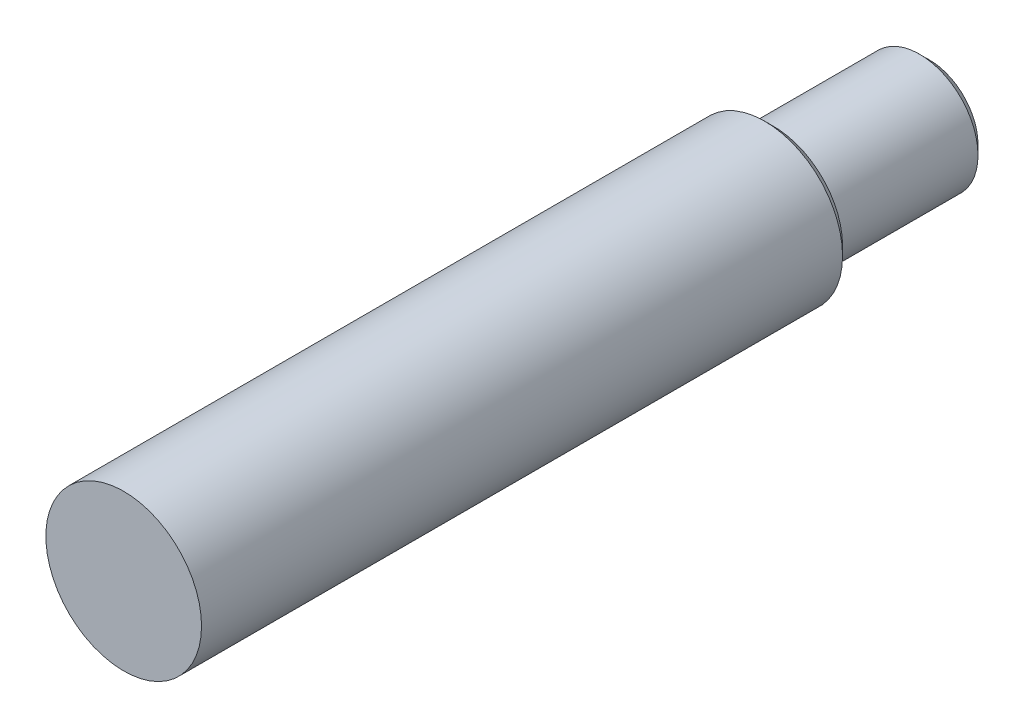
ISO-10303-21;
HEADER;
FILE_DESCRIPTION(('STEP AP214'),'2;1');
FILE_NAME('part.step','',(''),(''),'','','');
FILE_SCHEMA(('AUTOMOTIVE_DESIGN { 1 0 10303 214 1 1 1 1 }'));
ENDSEC;
DATA;
#1=APPLICATION_CONTEXT('core data for automotive mechanical design processes');
#2=APPLICATION_PROTOCOL_DEFINITION('international standard','automotive_design',2000,#1);
#3=PRODUCT_CONTEXT('',#1,'mechanical');
#4=PRODUCT('Part','Part','',(#3));
#5=PRODUCT_RELATED_PRODUCT_CATEGORY('part','',(#4));
#6=PRODUCT_DEFINITION_FORMATION('','',#4);
#7=PRODUCT_DEFINITION_CONTEXT('part definition',#1,'design');
#8=PRODUCT_DEFINITION('design','',#6,#7);
#9=PRODUCT_DEFINITION_SHAPE('','',#8);
#10=(LENGTH_UNIT() NAMED_UNIT(*) SI_UNIT(.MILLI.,.METRE.));
#11=(NAMED_UNIT(*) PLANE_ANGLE_UNIT() SI_UNIT($,.RADIAN.));
#12=(NAMED_UNIT(*) SI_UNIT($,.STERADIAN.) SOLID_ANGLE_UNIT());
#13=UNCERTAINTY_MEASURE_WITH_UNIT(LENGTH_MEASURE(1.E-05),#10,'distance_accuracy_value','');
#14=(GEOMETRIC_REPRESENTATION_CONTEXT(3) GLOBAL_UNCERTAINTY_ASSIGNED_CONTEXT((#13)) GLOBAL_UNIT_ASSIGNED_CONTEXT((#10,
#11,#12)) REPRESENTATION_CONTEXT('',''));
#15=CARTESIAN_POINT('',(0.,0.,0.));
#16=DIRECTION('',(0.,0.,1.));
#17=DIRECTION('',(1.,0.,0.));
#18=AXIS2_PLACEMENT_3D('',#15,#16,#17);
#19=CARTESIAN_POINT('',(0.,0.,0.));
#20=DIRECTION('',(0.,0.,-1.));
#21=DIRECTION('',(-1.,0.,0.));
#22=AXIS2_PLACEMENT_3D('',#19,#20,#21);
#23=PLANE('',#22);
#24=CARTESIAN_POINT('',(0.,0.,0.));
#25=DIRECTION('',(0.,0.,1.));
#26=DIRECTION('',(1.,0.,0.));
#27=AXIS2_PLACEMENT_3D('',#24,#25,#26);
#28=CIRCLE('',#27,4.);
#29=CARTESIAN_POINT('',(4.,0.,0.));
#30=VERTEX_POINT('',#29);
#31=EDGE_CURVE('E10',#30,#30,#28,.T.);
#32=ORIENTED_EDGE('',*,*,#31,.T.);
#33=EDGE_LOOP('',(#32));
#34=FACE_BOUND('',#33,.T.);
#35=ADVANCED_FACE('F39',(#34),#23,.F.);
#36=CARTESIAN_POINT('',(0.,0.,-41.4));
#37=DIRECTION('',(0.,0.,1.));
#38=DIRECTION('',(1.,0.,0.));
#39=AXIS2_PLACEMENT_3D('',#36,#37,#38);
#40=CYLINDRICAL_SURFACE('',#39,4.);
#41=ORIENTED_EDGE('',*,*,#31,.F.);
#42=EDGE_LOOP('',(#41));
#43=FACE_BOUND('',#42,.T.);
#44=CARTESIAN_POINT('',(0.,0.,-32.94));
#45=DIRECTION('',(0.,0.,1.));
#46=DIRECTION('',(1.,0.,0.));
#47=AXIS2_PLACEMENT_3D('',#44,#45,#46);
#48=CIRCLE('',#47,4.);
#49=CARTESIAN_POINT('',(4.,0.,-32.94));
#50=VERTEX_POINT('',#49);
#51=EDGE_CURVE('E45',#50,#50,#48,.T.);
#52=ORIENTED_EDGE('',*,*,#51,.T.);
#53=EDGE_LOOP('',(#52));
#54=FACE_BOUND('',#53,.T.);
#55=ADVANCED_FACE('F77',(#43,#54),#40,.T.);
#56=CARTESIAN_POINT('',(0.,0.,-33.4));
#57=DIRECTION('',(0.,0.,1.));
#58=DIRECTION('',(1.,0.,0.));
#59=AXIS2_PLACEMENT_3D('',#56,#57,#58);
#60=CONICAL_SURFACE('',#59,3.54,0.785398163397446);
#61=ORIENTED_EDGE('',*,*,#51,.F.);
#62=EDGE_LOOP('',(#61));
#63=FACE_BOUND('',#62,.T.);
#64=CARTESIAN_POINT('',(0.,0.,-33.4));
#65=DIRECTION('',(0.,0.,1.));
#66=DIRECTION('',(1.,0.,0.));
#67=AXIS2_PLACEMENT_3D('',#64,#65,#66);
#68=CIRCLE('',#67,3.54);
#69=CARTESIAN_POINT('',(3.54,0.,-33.4));
#70=VERTEX_POINT('',#69);
#71=EDGE_CURVE('E49',#70,#70,#68,.T.);
#72=ORIENTED_EDGE('',*,*,#71,.T.);
#73=EDGE_LOOP('',(#72));
#74=FACE_BOUND('',#73,.T.);
#75=ADVANCED_FACE('F81',(#63,#74),#60,.T.);
#76=CARTESIAN_POINT('',(0.,3.54,-33.4));
#77=DIRECTION('',(0.,0.,1.));
#78=DIRECTION('',(1.,0.,0.));
#79=AXIS2_PLACEMENT_3D('',#76,#77,#78);
#80=PLANE('',#79);
#81=ORIENTED_EDGE('',*,*,#71,.F.);
#82=EDGE_LOOP('',(#81));
#83=FACE_BOUND('',#82,.T.);
#84=CARTESIAN_POINT('',(0.,0.,-33.4));
#85=DIRECTION('',(0.,0.,1.));
#86=DIRECTION('',(1.,0.,0.));
#87=AXIS2_PLACEMENT_3D('',#84,#85,#86);
#88=CIRCLE('',#87,3.);
#89=CARTESIAN_POINT('',(3.,0.,-33.4));
#90=VERTEX_POINT('',#89);
#91=EDGE_CURVE('E53',#90,#90,#88,.T.);
#92=ORIENTED_EDGE('',*,*,#91,.T.);
#93=EDGE_LOOP('',(#92));
#94=FACE_BOUND('',#93,.T.);
#95=ADVANCED_FACE('F86',(#83,#94),#80,.F.);
#96=CARTESIAN_POINT('',(0.,0.,-41.4));
#97=DIRECTION('',(0.,0.,1.));
#98=DIRECTION('',(1.,0.,0.));
#99=AXIS2_PLACEMENT_3D('',#96,#97,#98);
#100=CYLINDRICAL_SURFACE('',#99,3.);
#101=ORIENTED_EDGE('',*,*,#91,.F.);
#102=EDGE_LOOP('',(#101));
#103=FACE_BOUND('',#102,.T.);
#104=CARTESIAN_POINT('',(0.,0.,-40.9));
#105=DIRECTION('',(0.,0.,1.));
#106=DIRECTION('',(1.,0.,0.));
#107=AXIS2_PLACEMENT_3D('',#104,#105,#106);
#108=CIRCLE('',#107,3.);
#109=CARTESIAN_POINT('',(3.,0.,-40.9));
#110=VERTEX_POINT('',#109);
#111=EDGE_CURVE('E58',#110,#110,#108,.T.);
#112=ORIENTED_EDGE('',*,*,#111,.T.);
#113=EDGE_LOOP('',(#112));
#114=FACE_BOUND('',#113,.T.);
#115=ADVANCED_FACE('F73',(#103,#114),#100,.T.);
#116=CARTESIAN_POINT('',(0.,0.,-41.4));
#117=DIRECTION('',(0.,0.,1.));
#118=DIRECTION('',(1.,0.,0.));
#119=AXIS2_PLACEMENT_3D('',#116,#117,#118);
#120=CONICAL_SURFACE('',#119,2.5,0.785398163397448);
#121=ORIENTED_EDGE('',*,*,#111,.F.);
#122=EDGE_LOOP('',(#121));
#123=FACE_BOUND('',#122,.T.);
#124=CARTESIAN_POINT('',(0.,0.,-41.4));
#125=DIRECTION('',(0.,0.,1.));
#126=DIRECTION('',(1.,0.,0.));
#127=AXIS2_PLACEMENT_3D('',#124,#125,#126);
#128=CIRCLE('',#127,2.5);
#129=CARTESIAN_POINT('',(2.5,0.,-41.4));
#130=VERTEX_POINT('',#129);
#131=EDGE_CURVE('E61',#130,#130,#128,.T.);
#132=ORIENTED_EDGE('',*,*,#131,.T.);
#133=EDGE_LOOP('',(#132));
#134=FACE_BOUND('',#133,.T.);
#135=ADVANCED_FACE('F65',(#123,#134),#120,.T.);
#136=CARTESIAN_POINT('',(0.,2.5,-41.4));
#137=DIRECTION('',(0.,0.,1.));
#138=DIRECTION('',(1.,0.,0.));
#139=AXIS2_PLACEMENT_3D('',#136,#137,#138);
#140=PLANE('',#139);
#141=ORIENTED_EDGE('',*,*,#131,.F.);
#142=EDGE_LOOP('',(#141));
#143=FACE_BOUND('',#142,.T.);
#144=ADVANCED_FACE('F67',(#143),#140,.F.);
#145=CLOSED_SHELL('',(#35,#55,#75,#95,#115,#135,#144));
#146=MANIFOLD_SOLID_BREP('B2',#145);
#147=ADVANCED_BREP_SHAPE_REPRESENTATION('',(#18,#146),#14);
#148=SHAPE_DEFINITION_REPRESENTATION(#9,#147);
ENDSEC;
END-ISO-10303-21;
